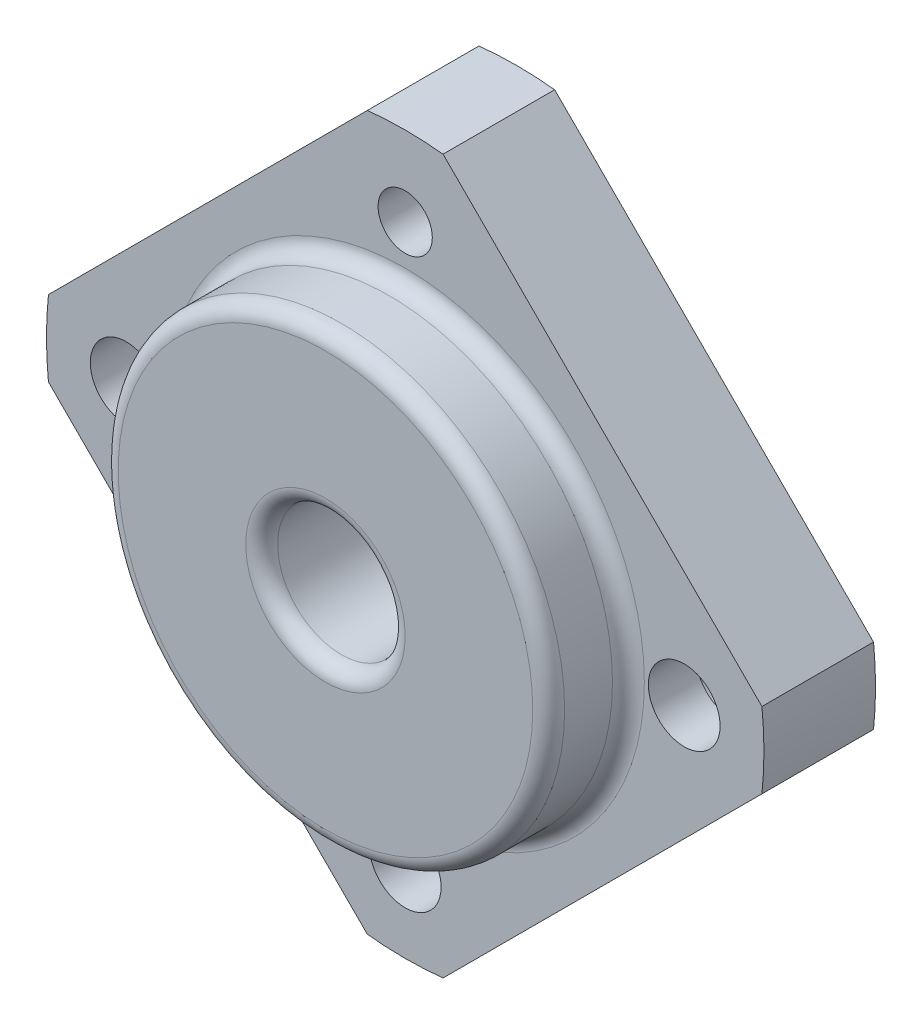
ISO-10303-21;
HEADER;
FILE_DESCRIPTION(('STEP AP214'),'2;1');
FILE_NAME('part.step','',(''),(''),'','','');
FILE_SCHEMA(('AUTOMOTIVE_DESIGN { 1 0 10303 214 1 1 1 1 }'));
ENDSEC;
DATA;
#1=APPLICATION_CONTEXT('core data for automotive mechanical design processes');
#2=APPLICATION_PROTOCOL_DEFINITION('international standard','automotive_design',2000,#1);
#3=PRODUCT_CONTEXT('',#1,'mechanical');
#4=PRODUCT('Part','Part','',(#3));
#5=PRODUCT_RELATED_PRODUCT_CATEGORY('part','',(#4));
#6=PRODUCT_DEFINITION_FORMATION('','',#4);
#7=PRODUCT_DEFINITION_CONTEXT('part definition',#1,'design');
#8=PRODUCT_DEFINITION('design','',#6,#7);
#9=PRODUCT_DEFINITION_SHAPE('','',#8);
#10=(LENGTH_UNIT() NAMED_UNIT(*) SI_UNIT(.MILLI.,.METRE.));
#11=(NAMED_UNIT(*) PLANE_ANGLE_UNIT() SI_UNIT($,.RADIAN.));
#12=(NAMED_UNIT(*) SI_UNIT($,.STERADIAN.) SOLID_ANGLE_UNIT());
#13=UNCERTAINTY_MEASURE_WITH_UNIT(LENGTH_MEASURE(1.E-05),#10,'distance_accuracy_value','');
#14=(GEOMETRIC_REPRESENTATION_CONTEXT(3) GLOBAL_UNCERTAINTY_ASSIGNED_CONTEXT((#13)) GLOBAL_UNIT_ASSIGNED_CONTEXT((#10,
#11,#12)) REPRESENTATION_CONTEXT('',''));
#15=CARTESIAN_POINT('',(0.,0.,0.));
#16=DIRECTION('',(0.,0.,1.));
#17=DIRECTION('',(1.,0.,0.));
#18=AXIS2_PLACEMENT_3D('',#15,#16,#17);
#19=CARTESIAN_POINT('',(12.3743686707646,12.3743686707646,7.));
#20=DIRECTION('',(-0.707106781186547,-0.707106781186548,0.));
#21=DIRECTION('',(0.707106781186548,-0.707106781186547,0.));
#22=AXIS2_PLACEMENT_3D('',#19,#20,#21);
#23=PLANE('',#22);
#24=DIRECTION('',(-0.707106781186548,0.707106781186547,0.));
#25=VECTOR('',#24,1.);
#26=CARTESIAN_POINT('',(12.3743686707646,12.3743686707646,0.));
#27=LINE('',#26,#25);
#28=CARTESIAN_POINT('',(22.3743686707646,2.37436867076461,0.));
#29=VERTEX_POINT('',#28);
#30=CARTESIAN_POINT('',(2.37436867076457,22.3743686707646,0.));
#31=VERTEX_POINT('',#30);
#32=EDGE_CURVE('E94',#29,#31,#27,.T.);
#33=ORIENTED_EDGE('',*,*,#32,.T.);
#34=DIRECTION('',(0.,0.,-1.));
#35=VECTOR('',#34,1.);
#36=CARTESIAN_POINT('',(2.37436867076457,22.3743686707646,7.));
#37=LINE('',#36,#35);
#38=CARTESIAN_POINT('',(2.37436867076457,22.3743686707646,7.));
#39=VERTEX_POINT('',#38);
#40=EDGE_CURVE('E186',#39,#31,#37,.T.);
#41=ORIENTED_EDGE('',*,*,#40,.F.);
#42=DIRECTION('',(-0.707106781186548,0.707106781186547,0.));
#43=VECTOR('',#42,1.);
#44=CARTESIAN_POINT('',(12.3743686707646,12.3743686707646,7.));
#45=LINE('',#44,#43);
#46=CARTESIAN_POINT('',(22.3743686707646,2.37436867076461,7.));
#47=VERTEX_POINT('',#46);
#48=EDGE_CURVE('E100',#47,#39,#45,.T.);
#49=ORIENTED_EDGE('',*,*,#48,.F.);
#50=DIRECTION('',(0.,0.,-1.));
#51=VECTOR('',#50,1.);
#52=CARTESIAN_POINT('',(22.3743686707646,2.37436867076461,7.));
#53=LINE('',#52,#51);
#54=EDGE_CURVE('E139',#47,#29,#53,.T.);
#55=ORIENTED_EDGE('',*,*,#54,.T.);
#56=EDGE_LOOP('',(#33,#41,#49,#55));
#57=FACE_BOUND('',#56,.T.);
#58=ADVANCED_FACE('F41',(#57),#23,.F.);
#59=CARTESIAN_POINT('',(0.,0.,7.));
#60=DIRECTION('',(0.,0.,-1.));
#61=DIRECTION('',(-1.,0.,0.));
#62=AXIS2_PLACEMENT_3D('',#59,#60,#61);
#63=CYLINDRICAL_SURFACE('',#62,22.5);
#64=CARTESIAN_POINT('',(0.,0.,0.));
#65=DIRECTION('',(0.,0.,1.));
#66=DIRECTION('',(1.,0.,0.));
#67=AXIS2_PLACEMENT_3D('',#64,#65,#66);
#68=CIRCLE('',#67,22.5);
#69=CARTESIAN_POINT('',(-2.37436867076459,22.3743686707646,0.));
#70=VERTEX_POINT('',#69);
#71=EDGE_CURVE('E145',#31,#70,#68,.T.);
#72=ORIENTED_EDGE('',*,*,#71,.T.);
#73=DIRECTION('',(0.,0.,-1.));
#74=VECTOR('',#73,1.);
#75=CARTESIAN_POINT('',(-2.37436867076459,22.3743686707646,7.));
#76=LINE('',#75,#74);
#77=CARTESIAN_POINT('',(-2.37436867076459,22.3743686707646,7.));
#78=VERTEX_POINT('',#77);
#79=EDGE_CURVE('E182',#78,#70,#76,.T.);
#80=ORIENTED_EDGE('',*,*,#79,.F.);
#81=CARTESIAN_POINT('',(0.,0.,7.));
#82=DIRECTION('',(0.,0.,1.));
#83=DIRECTION('',(1.,0.,0.));
#84=AXIS2_PLACEMENT_3D('',#81,#82,#83);
#85=CIRCLE('',#84,22.5);
#86=EDGE_CURVE('E393',#39,#78,#85,.T.);
#87=ORIENTED_EDGE('',*,*,#86,.F.);
#88=ORIENTED_EDGE('',*,*,#40,.T.);
#89=EDGE_LOOP('',(#72,#80,#87,#88));
#90=FACE_BOUND('',#89,.T.);
#91=ADVANCED_FACE('F244',(#90),#63,.T.);
#92=CARTESIAN_POINT('',(-12.3743686707646,12.3743686707646,7.));
#93=DIRECTION('',(0.707106781186548,-0.707106781186548,0.));
#94=DIRECTION('',(0.707106781186547,0.707106781186548,0.));
#95=AXIS2_PLACEMENT_3D('',#92,#93,#94);
#96=PLANE('',#95);
#97=DIRECTION('',(-0.707106781186547,-0.707106781186548,0.));
#98=VECTOR('',#97,1.);
#99=CARTESIAN_POINT('',(-12.3743686707646,12.3743686707646,0.));
#100=LINE('',#99,#98);
#101=CARTESIAN_POINT('',(-22.3743686707646,2.37436867076459,0.));
#102=VERTEX_POINT('',#101);
#103=EDGE_CURVE('E150',#70,#102,#100,.T.);
#104=ORIENTED_EDGE('',*,*,#103,.T.);
#105=DIRECTION('',(0.,0.,-1.));
#106=VECTOR('',#105,1.);
#107=CARTESIAN_POINT('',(-22.3743686707646,2.37436867076459,7.));
#108=LINE('',#107,#106);
#109=CARTESIAN_POINT('',(-22.3743686707646,2.37436867076459,7.));
#110=VERTEX_POINT('',#109);
#111=EDGE_CURVE('E178',#110,#102,#108,.T.);
#112=ORIENTED_EDGE('',*,*,#111,.F.);
#113=DIRECTION('',(-0.707106781186547,-0.707106781186548,0.));
#114=VECTOR('',#113,1.);
#115=CARTESIAN_POINT('',(-12.3743686707646,12.3743686707646,7.));
#116=LINE('',#115,#114);
#117=EDGE_CURVE('E396',#78,#110,#116,.T.);
#118=ORIENTED_EDGE('',*,*,#117,.F.);
#119=ORIENTED_EDGE('',*,*,#79,.T.);
#120=EDGE_LOOP('',(#104,#112,#118,#119));
#121=FACE_BOUND('',#120,.T.);
#122=ADVANCED_FACE('F250',(#121),#96,.F.);
#123=CARTESIAN_POINT('',(0.,0.,7.));
#124=DIRECTION('',(0.,0.,-1.));
#125=DIRECTION('',(-1.,0.,0.));
#126=AXIS2_PLACEMENT_3D('',#123,#124,#125);
#127=CYLINDRICAL_SURFACE('',#126,22.5);
#128=CARTESIAN_POINT('',(0.,0.,0.));
#129=DIRECTION('',(0.,0.,1.));
#130=DIRECTION('',(1.,0.,0.));
#131=AXIS2_PLACEMENT_3D('',#128,#129,#130);
#132=CIRCLE('',#131,22.5);
#133=CARTESIAN_POINT('',(-22.3743686707646,-2.37436867076458,0.));
#134=VERTEX_POINT('',#133);
#135=EDGE_CURVE('E153',#102,#134,#132,.T.);
#136=ORIENTED_EDGE('',*,*,#135,.T.);
#137=DIRECTION('',(0.,0.,-1.));
#138=VECTOR('',#137,1.);
#139=CARTESIAN_POINT('',(-22.3743686707646,-2.37436867076458,7.));
#140=LINE('',#139,#138);
#141=CARTESIAN_POINT('',(-22.3743686707646,-2.37436867076458,7.));
#142=VERTEX_POINT('',#141);
#143=EDGE_CURVE('E174',#142,#134,#140,.T.);
#144=ORIENTED_EDGE('',*,*,#143,.F.);
#145=CARTESIAN_POINT('',(0.,0.,7.));
#146=DIRECTION('',(0.,0.,1.));
#147=DIRECTION('',(1.,0.,0.));
#148=AXIS2_PLACEMENT_3D('',#145,#146,#147);
#149=CIRCLE('',#148,22.5);
#150=EDGE_CURVE('E399',#110,#142,#149,.T.);
#151=ORIENTED_EDGE('',*,*,#150,.F.);
#152=ORIENTED_EDGE('',*,*,#111,.T.);
#153=EDGE_LOOP('',(#136,#144,#151,#152));
#154=FACE_BOUND('',#153,.T.);
#155=ADVANCED_FACE('F256',(#154),#127,.T.);
#156=CARTESIAN_POINT('',(-12.3743686707646,-12.3743686707646,7.));
#157=DIRECTION('',(0.707106781186547,0.707106781186548,0.));
#158=DIRECTION('',(-0.707106781186548,0.707106781186547,0.));
#159=AXIS2_PLACEMENT_3D('',#156,#157,#158);
#160=PLANE('',#159);
#161=DIRECTION('',(0.707106781186548,-0.707106781186547,0.));
#162=VECTOR('',#161,1.);
#163=CARTESIAN_POINT('',(-12.3743686707646,-12.3743686707646,0.));
#164=LINE('',#163,#162);
#165=CARTESIAN_POINT('',(-2.37436867076459,-22.3743686707646,0.));
#166=VERTEX_POINT('',#165);
#167=EDGE_CURVE('E157',#134,#166,#164,.T.);
#168=ORIENTED_EDGE('',*,*,#167,.T.);
#169=DIRECTION('',(0.,0.,-1.));
#170=VECTOR('',#169,1.);
#171=CARTESIAN_POINT('',(-2.37436867076459,-22.3743686707646,7.));
#172=LINE('',#171,#170);
#173=CARTESIAN_POINT('',(-2.37436867076459,-22.3743686707646,7.));
#174=VERTEX_POINT('',#173);
#175=EDGE_CURVE('E132',#174,#166,#172,.T.);
#176=ORIENTED_EDGE('',*,*,#175,.F.);
#177=DIRECTION('',(0.707106781186547,-0.707106781186548,0.));
#178=VECTOR('',#177,1.);
#179=CARTESIAN_POINT('',(-12.3743686707646,-12.3743686707646,7.));
#180=LINE('',#179,#178);
#181=EDGE_CURVE('E120',#142,#174,#180,.T.);
#182=ORIENTED_EDGE('',*,*,#181,.F.);
#183=ORIENTED_EDGE('',*,*,#143,.T.);
#184=EDGE_LOOP('',(#168,#176,#182,#183));
#185=FACE_BOUND('',#184,.T.);
#186=ADVANCED_FACE('F260',(#185),#160,.F.);
#187=CARTESIAN_POINT('',(0.,0.,7.));
#188=DIRECTION('',(0.,0.,-1.));
#189=DIRECTION('',(-1.,0.,0.));
#190=AXIS2_PLACEMENT_3D('',#187,#188,#189);
#191=CYLINDRICAL_SURFACE('',#190,22.5);
#192=CARTESIAN_POINT('',(0.,0.,0.));
#193=DIRECTION('',(0.,0.,1.));
#194=DIRECTION('',(1.,0.,0.));
#195=AXIS2_PLACEMENT_3D('',#192,#193,#194);
#196=CIRCLE('',#195,22.5);
#197=CARTESIAN_POINT('',(2.37436867076458,-22.3743686707646,0.));
#198=VERTEX_POINT('',#197);
#199=EDGE_CURVE('E130',#166,#198,#196,.T.);
#200=ORIENTED_EDGE('',*,*,#199,.T.);
#201=DIRECTION('',(0.,0.,-1.));
#202=VECTOR('',#201,1.);
#203=CARTESIAN_POINT('',(2.37436867076458,-22.3743686707646,7.));
#204=LINE('',#203,#202);
#205=CARTESIAN_POINT('',(2.37436867076458,-22.3743686707646,7.));
#206=VERTEX_POINT('',#205);
#207=EDGE_CURVE('E127',#206,#198,#204,.T.);
#208=ORIENTED_EDGE('',*,*,#207,.F.);
#209=CARTESIAN_POINT('',(0.,0.,7.));
#210=DIRECTION('',(0.,0.,1.));
#211=DIRECTION('',(1.,0.,0.));
#212=AXIS2_PLACEMENT_3D('',#209,#210,#211);
#213=CIRCLE('',#212,22.5);
#214=EDGE_CURVE('E114',#174,#206,#213,.T.);
#215=ORIENTED_EDGE('',*,*,#214,.F.);
#216=ORIENTED_EDGE('',*,*,#175,.T.);
#217=EDGE_LOOP('',(#200,#208,#215,#216));
#218=FACE_BOUND('',#217,.T.);
#219=ADVANCED_FACE('F128',(#218),#191,.T.);
#220=CARTESIAN_POINT('',(12.3743686707646,-12.3743686707646,7.));
#221=DIRECTION('',(-0.707106781186547,0.707106781186547,0.));
#222=DIRECTION('',(-0.707106781186548,-0.707106781186548,0.));
#223=AXIS2_PLACEMENT_3D('',#220,#221,#222);
#224=PLANE('',#223);
#225=DIRECTION('',(0.707106781186548,0.707106781186548,0.));
#226=VECTOR('',#225,1.);
#227=CARTESIAN_POINT('',(12.3743686707646,-12.3743686707646,0.));
#228=LINE('',#227,#226);
#229=CARTESIAN_POINT('',(22.3743686707646,-2.37436867076459,0.));
#230=VERTEX_POINT('',#229);
#231=EDGE_CURVE('E87',#198,#230,#228,.T.);
#232=ORIENTED_EDGE('',*,*,#231,.T.);
#233=DIRECTION('',(0.,0.,-1.));
#234=VECTOR('',#233,1.);
#235=CARTESIAN_POINT('',(22.3743686707646,-2.37436867076459,7.));
#236=LINE('',#235,#234);
#237=CARTESIAN_POINT('',(22.3743686707646,-2.37436867076459,7.));
#238=VERTEX_POINT('',#237);
#239=EDGE_CURVE('E133',#238,#230,#236,.T.);
#240=ORIENTED_EDGE('',*,*,#239,.F.);
#241=DIRECTION('',(0.707106781186548,0.707106781186547,0.));
#242=VECTOR('',#241,1.);
#243=CARTESIAN_POINT('',(12.3743686707646,-12.3743686707646,7.));
#244=LINE('',#243,#242);
#245=EDGE_CURVE('E118',#206,#238,#244,.T.);
#246=ORIENTED_EDGE('',*,*,#245,.F.);
#247=ORIENTED_EDGE('',*,*,#207,.T.);
#248=EDGE_LOOP('',(#232,#240,#246,#247));
#249=FACE_BOUND('',#248,.T.);
#250=ADVANCED_FACE('F135',(#249),#224,.F.);
#251=CARTESIAN_POINT('',(0.,0.,7.));
#252=DIRECTION('',(0.,0.,-1.));
#253=DIRECTION('',(-1.,0.,0.));
#254=AXIS2_PLACEMENT_3D('',#251,#252,#253);
#255=CYLINDRICAL_SURFACE('',#254,22.5);
#256=CARTESIAN_POINT('',(0.,0.,0.));
#257=DIRECTION('',(0.,0.,1.));
#258=DIRECTION('',(1.,0.,0.));
#259=AXIS2_PLACEMENT_3D('',#256,#257,#258);
#260=CIRCLE('',#259,22.5);
#261=EDGE_CURVE('E164',#230,#29,#260,.T.);
#262=ORIENTED_EDGE('',*,*,#261,.T.);
#263=ORIENTED_EDGE('',*,*,#54,.F.);
#264=CARTESIAN_POINT('',(0.,0.,7.));
#265=DIRECTION('',(0.,0.,1.));
#266=DIRECTION('',(1.,0.,0.));
#267=AXIS2_PLACEMENT_3D('',#264,#265,#266);
#268=CIRCLE('',#267,22.5);
#269=EDGE_CURVE('E59',#238,#47,#268,.T.);
#270=ORIENTED_EDGE('',*,*,#269,.F.);
#271=ORIENTED_EDGE('',*,*,#239,.T.);
#272=EDGE_LOOP('',(#262,#263,#270,#271));
#273=FACE_BOUND('',#272,.T.);
#274=ADVANCED_FACE('F269',(#273),#255,.T.);
#275=CARTESIAN_POINT('',(0.,0.,7.));
#276=DIRECTION('',(0.,0.,1.));
#277=DIRECTION('',(1.,0.,0.));
#278=AXIS2_PLACEMENT_3D('',#275,#276,#277);
#279=PLANE('',#278);
#280=CARTESIAN_POINT('',(0.,0.,7.));
#281=DIRECTION('',(0.,0.,1.));
#282=DIRECTION('',(1.,0.,0.));
#283=AXIS2_PLACEMENT_3D('',#280,#281,#282);
#284=CIRCLE('',#283,15.);
#285=CARTESIAN_POINT('',(15.,0.,7.));
#286=VERTEX_POINT('',#285);
#287=EDGE_CURVE('E216',#286,#286,#284,.F.);
#288=ORIENTED_EDGE('',*,*,#287,.T.);
#289=EDGE_LOOP('',(#288));
#290=FACE_BOUND('',#289,.T.);
#291=CARTESIAN_POINT('',(0.,17.5,7.));
#292=DIRECTION('',(0.,0.,1.));
#293=DIRECTION('',(1.,0.,0.));
#294=AXIS2_PLACEMENT_3D('',#291,#292,#293);
#295=CIRCLE('',#294,1.7);
#296=CARTESIAN_POINT('',(1.7,17.5,7.));
#297=VERTEX_POINT('',#296);
#298=EDGE_CURVE('E204',#297,#297,#295,.T.);
#299=ORIENTED_EDGE('',*,*,#298,.F.);
#300=EDGE_LOOP('',(#299));
#301=FACE_BOUND('',#300,.T.);
#302=CARTESIAN_POINT('',(17.5,0.,7.));
#303=DIRECTION('',(0.,0.,1.));
#304=DIRECTION('',(1.,0.,0.));
#305=AXIS2_PLACEMENT_3D('',#302,#303,#304);
#306=CIRCLE('',#305,2.25);
#307=CARTESIAN_POINT('',(19.75,0.,7.));
#308=VERTEX_POINT('',#307);
#309=EDGE_CURVE('E200',#308,#308,#306,.T.);
#310=ORIENTED_EDGE('',*,*,#309,.F.);
#311=EDGE_LOOP('',(#310));
#312=FACE_BOUND('',#311,.T.);
#313=CARTESIAN_POINT('',(-17.5,0.,7.));
#314=DIRECTION('',(0.,0.,1.));
#315=DIRECTION('',(1.,0.,0.));
#316=AXIS2_PLACEMENT_3D('',#313,#314,#315);
#317=CIRCLE('',#316,2.25);
#318=CARTESIAN_POINT('',(-15.25,0.,7.));
#319=VERTEX_POINT('',#318);
#320=EDGE_CURVE('E195',#319,#319,#317,.T.);
#321=ORIENTED_EDGE('',*,*,#320,.F.);
#322=EDGE_LOOP('',(#321));
#323=FACE_BOUND('',#322,.T.);
#324=CARTESIAN_POINT('',(0.,-17.5,7.));
#325=DIRECTION('',(0.,0.,1.));
#326=DIRECTION('',(1.,0.,0.));
#327=AXIS2_PLACEMENT_3D('',#324,#325,#326);
#328=CIRCLE('',#327,2.25);
#329=CARTESIAN_POINT('',(2.25,-17.5,7.));
#330=VERTEX_POINT('',#329);
#331=EDGE_CURVE('E191',#330,#330,#328,.T.);
#332=ORIENTED_EDGE('',*,*,#331,.F.);
#333=EDGE_LOOP('',(#332));
#334=FACE_BOUND('',#333,.T.);
#335=ORIENTED_EDGE('',*,*,#48,.T.);
#336=ORIENTED_EDGE('',*,*,#86,.T.);
#337=ORIENTED_EDGE('',*,*,#117,.T.);
#338=ORIENTED_EDGE('',*,*,#150,.T.);
#339=ORIENTED_EDGE('',*,*,#181,.T.);
#340=ORIENTED_EDGE('',*,*,#214,.T.);
#341=ORIENTED_EDGE('',*,*,#245,.T.);
#342=ORIENTED_EDGE('',*,*,#269,.T.);
#343=EDGE_LOOP('',(#335,#336,#337,#338,#339,#340,#341,#342));
#344=FACE_BOUND('',#343,.T.);
#345=ADVANCED_FACE('F116',(#290,#301,#312,#323,#334,#344),#279,.T.);
#346=CARTESIAN_POINT('',(0.,0.,0.));
#347=DIRECTION('',(0.,0.,1.));
#348=DIRECTION('',(1.,0.,0.));
#349=AXIS2_PLACEMENT_3D('',#346,#347,#348);
#350=PLANE('',#349);
#351=CARTESIAN_POINT('',(0.,0.,0.));
#352=DIRECTION('',(0.,0.,1.));
#353=DIRECTION('',(1.,0.,0.));
#354=AXIS2_PLACEMENT_3D('',#351,#352,#353);
#355=CIRCLE('',#354,4.);
#356=CARTESIAN_POINT('',(4.,0.,0.));
#357=VERTEX_POINT('',#356);
#358=EDGE_CURVE('E342',#357,#357,#355,.T.);
#359=ORIENTED_EDGE('',*,*,#358,.T.);
#360=EDGE_LOOP('',(#359));
#361=FACE_BOUND('',#360,.T.);
#362=CARTESIAN_POINT('',(17.5,0.,0.));
#363=DIRECTION('',(0.,0.,-1.));
#364=DIRECTION('',(-1.,0.,0.));
#365=AXIS2_PLACEMENT_3D('',#362,#363,#364);
#366=CIRCLE('',#365,3.25);
#367=CARTESIAN_POINT('',(14.25,0.,0.));
#368=VERTEX_POINT('',#367);
#369=EDGE_CURVE('E364',#368,#368,#366,.T.);
#370=ORIENTED_EDGE('',*,*,#369,.F.);
#371=EDGE_LOOP('',(#370));
#372=FACE_BOUND('',#371,.T.);
#373=CARTESIAN_POINT('',(0.,17.5,0.));
#374=DIRECTION('',(0.,0.,-1.));
#375=DIRECTION('',(-1.,0.,0.));
#376=AXIS2_PLACEMENT_3D('',#373,#374,#375);
#377=CIRCLE('',#376,3.25);
#378=CARTESIAN_POINT('',(-3.25,17.5,0.));
#379=VERTEX_POINT('',#378);
#380=EDGE_CURVE('E368',#379,#379,#377,.T.);
#381=ORIENTED_EDGE('',*,*,#380,.F.);
#382=EDGE_LOOP('',(#381));
#383=FACE_BOUND('',#382,.T.);
#384=CARTESIAN_POINT('',(-17.5,0.,0.));
#385=DIRECTION('',(0.,0.,-1.));
#386=DIRECTION('',(-1.,0.,0.));
#387=AXIS2_PLACEMENT_3D('',#384,#385,#386);
#388=CIRCLE('',#387,3.25);
#389=CARTESIAN_POINT('',(-20.75,0.,0.));
#390=VERTEX_POINT('',#389);
#391=EDGE_CURVE('E376',#390,#390,#388,.T.);
#392=ORIENTED_EDGE('',*,*,#391,.F.);
#393=EDGE_LOOP('',(#392));
#394=FACE_BOUND('',#393,.T.);
#395=CARTESIAN_POINT('',(0.,-17.5,0.));
#396=DIRECTION('',(0.,0.,-1.));
#397=DIRECTION('',(-1.,0.,0.));
#398=AXIS2_PLACEMENT_3D('',#395,#396,#397);
#399=CIRCLE('',#398,3.25);
#400=CARTESIAN_POINT('',(-3.25,-17.5,0.));
#401=VERTEX_POINT('',#400);
#402=EDGE_CURVE('E384',#401,#401,#399,.T.);
#403=ORIENTED_EDGE('',*,*,#402,.F.);
#404=EDGE_LOOP('',(#403));
#405=FACE_BOUND('',#404,.T.);
#406=ORIENTED_EDGE('',*,*,#32,.F.);
#407=ORIENTED_EDGE('',*,*,#261,.F.);
#408=ORIENTED_EDGE('',*,*,#231,.F.);
#409=ORIENTED_EDGE('',*,*,#199,.F.);
#410=ORIENTED_EDGE('',*,*,#167,.F.);
#411=ORIENTED_EDGE('',*,*,#135,.F.);
#412=ORIENTED_EDGE('',*,*,#103,.F.);
#413=ORIENTED_EDGE('',*,*,#71,.F.);
#414=EDGE_LOOP('',(#406,#407,#408,#409,#410,#411,#412,#413));
#415=FACE_BOUND('',#414,.T.);
#416=ADVANCED_FACE('F273',(#361,#372,#383,#394,#405,#415),#350,.F.);
#417=CARTESIAN_POINT('',(0.,-17.5,4.));
#418=DIRECTION('',(0.,0.,-1.));
#419=DIRECTION('',(-1.,0.,0.));
#420=AXIS2_PLACEMENT_3D('',#417,#418,#419);
#421=CYLINDRICAL_SURFACE('',#420,3.25);
#422=CARTESIAN_POINT('',(0.,-17.5,4.));
#423=DIRECTION('',(0.,0.,-1.));
#424=DIRECTION('',(-1.,0.,0.));
#425=AXIS2_PLACEMENT_3D('',#422,#423,#424);
#426=CIRCLE('',#425,3.25);
#427=CARTESIAN_POINT('',(-3.25,-17.5,4.));
#428=VERTEX_POINT('',#427);
#429=EDGE_CURVE('E208',#428,#428,#426,.T.);
#430=ORIENTED_EDGE('',*,*,#429,.F.);
#431=EDGE_LOOP('',(#430));
#432=FACE_BOUND('',#431,.T.);
#433=ORIENTED_EDGE('',*,*,#402,.T.);
#434=EDGE_LOOP('',(#433));
#435=FACE_BOUND('',#434,.T.);
#436=ADVANCED_FACE('F276',(#432,#435),#421,.F.);
#437=CARTESIAN_POINT('',(0.,-17.5,4.));
#438=DIRECTION('',(0.,0.,-1.));
#439=DIRECTION('',(-1.,0.,0.));
#440=AXIS2_PLACEMENT_3D('',#437,#438,#439);
#441=PLANE('',#440);
#442=CARTESIAN_POINT('',(0.,-17.5,4.));
#443=DIRECTION('',(0.,0.,-1.));
#444=DIRECTION('',(-1.,0.,0.));
#445=AXIS2_PLACEMENT_3D('',#442,#443,#444);
#446=CIRCLE('',#445,2.25);
#447=CARTESIAN_POINT('',(-2.25,-17.5,4.));
#448=VERTEX_POINT('',#447);
#449=EDGE_CURVE('E344',#448,#448,#446,.T.);
#450=ORIENTED_EDGE('',*,*,#449,.F.);
#451=EDGE_LOOP('',(#450));
#452=FACE_BOUND('',#451,.T.);
#453=ORIENTED_EDGE('',*,*,#429,.T.);
#454=EDGE_LOOP('',(#453));
#455=FACE_BOUND('',#454,.T.);
#456=ADVANCED_FACE('F281',(#452,#455),#441,.T.);
#457=CARTESIAN_POINT('',(-17.5,0.,4.));
#458=DIRECTION('',(0.,0.,-1.));
#459=DIRECTION('',(-1.,0.,0.));
#460=AXIS2_PLACEMENT_3D('',#457,#458,#459);
#461=CYLINDRICAL_SURFACE('',#460,3.25);
#462=CARTESIAN_POINT('',(-17.5,0.,4.));
#463=DIRECTION('',(0.,0.,-1.));
#464=DIRECTION('',(-1.,0.,0.));
#465=AXIS2_PLACEMENT_3D('',#462,#463,#464);
#466=CIRCLE('',#465,3.25);
#467=CARTESIAN_POINT('',(-20.75,0.,4.));
#468=VERTEX_POINT('',#467);
#469=EDGE_CURVE('E380',#468,#468,#466,.T.);
#470=ORIENTED_EDGE('',*,*,#469,.F.);
#471=EDGE_LOOP('',(#470));
#472=FACE_BOUND('',#471,.T.);
#473=ORIENTED_EDGE('',*,*,#391,.T.);
#474=EDGE_LOOP('',(#473));
#475=FACE_BOUND('',#474,.T.);
#476=ADVANCED_FACE('F284',(#472,#475),#461,.F.);
#477=CARTESIAN_POINT('',(-17.5,0.,4.));
#478=DIRECTION('',(0.,0.,-1.));
#479=DIRECTION('',(-1.,0.,0.));
#480=AXIS2_PLACEMENT_3D('',#477,#478,#479);
#481=PLANE('',#480);
#482=CARTESIAN_POINT('',(-17.5,0.,4.));
#483=DIRECTION('',(0.,0.,-1.));
#484=DIRECTION('',(-1.,0.,0.));
#485=AXIS2_PLACEMENT_3D('',#482,#483,#484);
#486=CIRCLE('',#485,2.25);
#487=CARTESIAN_POINT('',(-19.75,0.,4.));
#488=VERTEX_POINT('',#487);
#489=EDGE_CURVE('E348',#488,#488,#486,.T.);
#490=ORIENTED_EDGE('',*,*,#489,.F.);
#491=EDGE_LOOP('',(#490));
#492=FACE_BOUND('',#491,.T.);
#493=ORIENTED_EDGE('',*,*,#469,.T.);
#494=EDGE_LOOP('',(#493));
#495=FACE_BOUND('',#494,.T.);
#496=ADVANCED_FACE('F289',(#492,#495),#481,.T.);
#497=CARTESIAN_POINT('',(0.,17.5,4.));
#498=DIRECTION('',(0.,0.,-1.));
#499=DIRECTION('',(-1.,0.,0.));
#500=AXIS2_PLACEMENT_3D('',#497,#498,#499);
#501=CYLINDRICAL_SURFACE('',#500,3.25);
#502=CARTESIAN_POINT('',(0.,17.5,4.));
#503=DIRECTION('',(0.,0.,-1.));
#504=DIRECTION('',(-1.,0.,0.));
#505=AXIS2_PLACEMENT_3D('',#502,#503,#504);
#506=CIRCLE('',#505,3.25);
#507=CARTESIAN_POINT('',(-3.25,17.5,4.));
#508=VERTEX_POINT('',#507);
#509=EDGE_CURVE('E372',#508,#508,#506,.T.);
#510=ORIENTED_EDGE('',*,*,#509,.F.);
#511=EDGE_LOOP('',(#510));
#512=FACE_BOUND('',#511,.T.);
#513=ORIENTED_EDGE('',*,*,#380,.T.);
#514=EDGE_LOOP('',(#513));
#515=FACE_BOUND('',#514,.T.);
#516=ADVANCED_FACE('F292',(#512,#515),#501,.F.);
#517=CARTESIAN_POINT('',(0.,17.5,4.));
#518=DIRECTION('',(0.,0.,-1.));
#519=DIRECTION('',(-1.,0.,0.));
#520=AXIS2_PLACEMENT_3D('',#517,#518,#519);
#521=PLANE('',#520);
#522=CARTESIAN_POINT('',(0.,17.5,4.));
#523=DIRECTION('',(0.,0.,-1.));
#524=DIRECTION('',(-1.,0.,0.));
#525=AXIS2_PLACEMENT_3D('',#522,#523,#524);
#526=CIRCLE('',#525,1.7);
#527=CARTESIAN_POINT('',(-1.7,17.5,4.));
#528=VERTEX_POINT('',#527);
#529=EDGE_CURVE('E196',#528,#528,#526,.T.);
#530=ORIENTED_EDGE('',*,*,#529,.F.);
#531=EDGE_LOOP('',(#530));
#532=FACE_BOUND('',#531,.T.);
#533=ORIENTED_EDGE('',*,*,#509,.T.);
#534=EDGE_LOOP('',(#533));
#535=FACE_BOUND('',#534,.T.);
#536=ADVANCED_FACE('F297',(#532,#535),#521,.T.);
#537=CARTESIAN_POINT('',(17.5,0.,4.));
#538=DIRECTION('',(0.,0.,-1.));
#539=DIRECTION('',(-1.,0.,0.));
#540=AXIS2_PLACEMENT_3D('',#537,#538,#539);
#541=CYLINDRICAL_SURFACE('',#540,3.25);
#542=CARTESIAN_POINT('',(17.5,0.,4.));
#543=DIRECTION('',(0.,0.,-1.));
#544=DIRECTION('',(-1.,0.,0.));
#545=AXIS2_PLACEMENT_3D('',#542,#543,#544);
#546=CIRCLE('',#545,3.25);
#547=CARTESIAN_POINT('',(14.25,0.,4.));
#548=VERTEX_POINT('',#547);
#549=EDGE_CURVE('E146',#548,#548,#546,.T.);
#550=ORIENTED_EDGE('',*,*,#549,.F.);
#551=EDGE_LOOP('',(#550));
#552=FACE_BOUND('',#551,.T.);
#553=ORIENTED_EDGE('',*,*,#369,.T.);
#554=EDGE_LOOP('',(#553));
#555=FACE_BOUND('',#554,.T.);
#556=ADVANCED_FACE('F300',(#552,#555),#541,.F.);
#557=CARTESIAN_POINT('',(17.5,0.,4.));
#558=DIRECTION('',(0.,0.,-1.));
#559=DIRECTION('',(-1.,0.,0.));
#560=AXIS2_PLACEMENT_3D('',#557,#558,#559);
#561=PLANE('',#560);
#562=CARTESIAN_POINT('',(17.5,0.,4.));
#563=DIRECTION('',(0.,0.,-1.));
#564=DIRECTION('',(-1.,0.,0.));
#565=AXIS2_PLACEMENT_3D('',#562,#563,#564);
#566=CIRCLE('',#565,2.25);
#567=CARTESIAN_POINT('',(15.25,0.,4.));
#568=VERTEX_POINT('',#567);
#569=EDGE_CURVE('E354',#568,#568,#566,.T.);
#570=ORIENTED_EDGE('',*,*,#569,.F.);
#571=EDGE_LOOP('',(#570));
#572=FACE_BOUND('',#571,.T.);
#573=ORIENTED_EDGE('',*,*,#549,.T.);
#574=EDGE_LOOP('',(#573));
#575=FACE_BOUND('',#574,.T.);
#576=ADVANCED_FACE('F307',(#572,#575),#561,.T.);
#577=CARTESIAN_POINT('',(0.,-17.5,8.));
#578=DIRECTION('',(0.,0.,-1.));
#579=DIRECTION('',(-1.,0.,0.));
#580=AXIS2_PLACEMENT_3D('',#577,#578,#579);
#581=CYLINDRICAL_SURFACE('',#580,2.25);
#582=ORIENTED_EDGE('',*,*,#331,.T.);
#583=EDGE_LOOP('',(#582));
#584=FACE_BOUND('',#583,.T.);
#585=ORIENTED_EDGE('',*,*,#449,.T.);
#586=EDGE_LOOP('',(#585));
#587=FACE_BOUND('',#586,.T.);
#588=ADVANCED_FACE('F311',(#584,#587),#581,.F.);
#589=CARTESIAN_POINT('',(-17.5,0.,8.));
#590=DIRECTION('',(0.,0.,-1.));
#591=DIRECTION('',(-1.,0.,0.));
#592=AXIS2_PLACEMENT_3D('',#589,#590,#591);
#593=CYLINDRICAL_SURFACE('',#592,2.25);
#594=ORIENTED_EDGE('',*,*,#320,.T.);
#595=EDGE_LOOP('',(#594));
#596=FACE_BOUND('',#595,.T.);
#597=ORIENTED_EDGE('',*,*,#489,.T.);
#598=EDGE_LOOP('',(#597));
#599=FACE_BOUND('',#598,.T.);
#600=ADVANCED_FACE('F315',(#596,#599),#593,.F.);
#601=CARTESIAN_POINT('',(17.5,0.,8.));
#602=DIRECTION('',(0.,0.,-1.));
#603=DIRECTION('',(-1.,0.,0.));
#604=AXIS2_PLACEMENT_3D('',#601,#602,#603);
#605=CYLINDRICAL_SURFACE('',#604,2.25);
#606=ORIENTED_EDGE('',*,*,#309,.T.);
#607=EDGE_LOOP('',(#606));
#608=FACE_BOUND('',#607,.T.);
#609=ORIENTED_EDGE('',*,*,#569,.T.);
#610=EDGE_LOOP('',(#609));
#611=FACE_BOUND('',#610,.T.);
#612=ADVANCED_FACE('F319',(#608,#611),#605,.F.);
#613=CARTESIAN_POINT('',(0.,17.5,8.));
#614=DIRECTION('',(0.,0.,-1.));
#615=DIRECTION('',(-1.,0.,0.));
#616=AXIS2_PLACEMENT_3D('',#613,#614,#615);
#617=CYLINDRICAL_SURFACE('',#616,1.7);
#618=ORIENTED_EDGE('',*,*,#298,.T.);
#619=EDGE_LOOP('',(#618));
#620=FACE_BOUND('',#619,.T.);
#621=ORIENTED_EDGE('',*,*,#529,.T.);
#622=EDGE_LOOP('',(#621));
#623=FACE_BOUND('',#622,.T.);
#624=ADVANCED_FACE('F323',(#620,#623),#617,.F.);
#625=CARTESIAN_POINT('',(0.,0.,12.));
#626=DIRECTION('',(0.,0.,-1.));
#627=DIRECTION('',(-1.,0.,0.));
#628=AXIS2_PLACEMENT_3D('',#625,#626,#627);
#629=CYLINDRICAL_SURFACE('',#628,14.);
#630=CARTESIAN_POINT('',(0.,0.,8.));
#631=DIRECTION('',(0.,0.,1.));
#632=DIRECTION('',(1.,0.,0.));
#633=AXIS2_PLACEMENT_3D('',#630,#631,#632);
#634=CIRCLE('',#633,14.);
#635=CARTESIAN_POINT('',(14.,0.,8.));
#636=VERTEX_POINT('',#635);
#637=EDGE_CURVE('E212',#636,#636,#634,.T.);
#638=ORIENTED_EDGE('',*,*,#637,.T.);
#639=EDGE_LOOP('',(#638));
#640=FACE_BOUND('',#639,.T.);
#641=CARTESIAN_POINT('',(0.,0.,11.));
#642=DIRECTION('',(0.,0.,1.));
#643=DIRECTION('',(1.,0.,0.));
#644=AXIS2_PLACEMENT_3D('',#641,#642,#643);
#645=CIRCLE('',#644,14.);
#646=CARTESIAN_POINT('',(14.,0.,11.));
#647=VERTEX_POINT('',#646);
#648=EDGE_CURVE('E190',#647,#647,#645,.F.);
#649=ORIENTED_EDGE('',*,*,#648,.T.);
#650=EDGE_LOOP('',(#649));
#651=FACE_BOUND('',#650,.T.);
#652=ADVANCED_FACE('F327',(#640,#651),#629,.T.);
#653=CARTESIAN_POINT('',(0.,0.,12.));
#654=DIRECTION('',(0.,0.,1.));
#655=DIRECTION('',(1.,0.,0.));
#656=AXIS2_PLACEMENT_3D('',#653,#654,#655);
#657=PLANE('',#656);
#658=CARTESIAN_POINT('',(0.,0.,12.));
#659=DIRECTION('',(0.,0.,1.));
#660=DIRECTION('',(1.,0.,0.));
#661=AXIS2_PLACEMENT_3D('',#658,#659,#660);
#662=CIRCLE('',#661,13.);
#663=CARTESIAN_POINT('',(13.,0.,12.));
#664=VERTEX_POINT('',#663);
#665=EDGE_CURVE('E51',#664,#664,#662,.T.);
#666=ORIENTED_EDGE('',*,*,#665,.T.);
#667=EDGE_LOOP('',(#666));
#668=FACE_BOUND('',#667,.T.);
#669=CARTESIAN_POINT('',(0.,0.,12.));
#670=DIRECTION('',(0.,0.,1.));
#671=DIRECTION('',(1.,0.,0.));
#672=AXIS2_PLACEMENT_3D('',#669,#670,#671);
#673=CIRCLE('',#672,5.);
#674=CARTESIAN_POINT('',(5.,0.,12.));
#675=VERTEX_POINT('',#674);
#676=EDGE_CURVE('E220',#675,#675,#673,.F.);
#677=ORIENTED_EDGE('',*,*,#676,.T.);
#678=EDGE_LOOP('',(#677));
#679=FACE_BOUND('',#678,.T.);
#680=ADVANCED_FACE('F227',(#668,#679),#657,.T.);
#681=CARTESIAN_POINT('',(0.,0.,-3.));
#682=DIRECTION('',(0.,0.,1.));
#683=DIRECTION('',(1.,0.,0.));
#684=AXIS2_PLACEMENT_3D('',#681,#682,#683);
#685=CYLINDRICAL_SURFACE('',#684,4.);
#686=CARTESIAN_POINT('',(0.,0.,11.));
#687=DIRECTION('',(0.,0.,1.));
#688=DIRECTION('',(1.,0.,0.));
#689=AXIS2_PLACEMENT_3D('',#686,#687,#688);
#690=CIRCLE('',#689,4.);
#691=CARTESIAN_POINT('',(4.,0.,11.));
#692=VERTEX_POINT('',#691);
#693=EDGE_CURVE('E11',#692,#692,#690,.T.);
#694=ORIENTED_EDGE('',*,*,#693,.T.);
#695=EDGE_LOOP('',(#694));
#696=FACE_BOUND('',#695,.T.);
#697=ORIENTED_EDGE('',*,*,#358,.F.);
#698=EDGE_LOOP('',(#697));
#699=FACE_BOUND('',#698,.T.);
#700=ADVANCED_FACE('F239',(#696,#699),#685,.F.);
#701=CARTESIAN_POINT('',(0.,0.,8.));
#702=DIRECTION('',(0.,0.,1.));
#703=DIRECTION('',(1.,0.,0.));
#704=AXIS2_PLACEMENT_3D('',#701,#702,#703);
#705=TOROIDAL_SURFACE('',#704,15.,1.);
#706=ORIENTED_EDGE('',*,*,#287,.F.);
#707=EDGE_LOOP('',(#706));
#708=FACE_BOUND('',#707,.T.);
#709=ORIENTED_EDGE('',*,*,#637,.F.);
#710=EDGE_LOOP('',(#709));
#711=FACE_BOUND('',#710,.T.);
#712=ADVANCED_FACE('F232',(#708,#711),#705,.F.);
#713=CARTESIAN_POINT('',(0.,0.,11.));
#714=DIRECTION('',(0.,0.,1.));
#715=DIRECTION('',(1.,0.,0.));
#716=AXIS2_PLACEMENT_3D('',#713,#714,#715);
#717=TOROIDAL_SURFACE('',#716,13.,1.);
#718=ORIENTED_EDGE('',*,*,#648,.F.);
#719=EDGE_LOOP('',(#718));
#720=FACE_BOUND('',#719,.T.);
#721=ORIENTED_EDGE('',*,*,#665,.F.);
#722=EDGE_LOOP('',(#721));
#723=FACE_BOUND('',#722,.T.);
#724=ADVANCED_FACE('F230',(#720,#723),#717,.T.);
#725=CARTESIAN_POINT('',(0.,0.,11.));
#726=DIRECTION('',(0.,0.,1.));
#727=DIRECTION('',(1.,0.,0.));
#728=AXIS2_PLACEMENT_3D('',#725,#726,#727);
#729=TOROIDAL_SURFACE('',#728,5.,1.);
#730=ORIENTED_EDGE('',*,*,#676,.F.);
#731=EDGE_LOOP('',(#730));
#732=FACE_BOUND('',#731,.T.);
#733=ORIENTED_EDGE('',*,*,#693,.F.);
#734=EDGE_LOOP('',(#733));
#735=FACE_BOUND('',#734,.T.);
#736=ADVANCED_FACE('F43',(#732,#735),#729,.T.);
#737=CLOSED_SHELL('',(#58,#91,#122,#155,#186,#219,#250,#274,#345,#416,#436,#456,#476,#496,#516,
#536,#556,#576,#588,#600,#612,#624,#652,#680,#700,#712,#724,#736));
#738=MANIFOLD_SOLID_BREP('B2',#737);
#739=ADVANCED_BREP_SHAPE_REPRESENTATION('',(#18,#738),#14);
#740=SHAPE_DEFINITION_REPRESENTATION(#9,#739);
ENDSEC;
END-ISO-10303-21;
